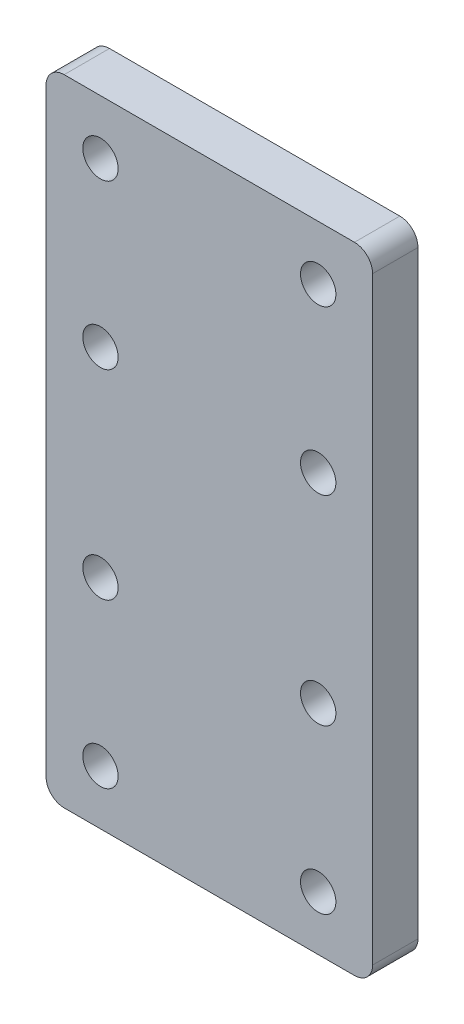
ISO-10303-21;
HEADER;
FILE_DESCRIPTION(('STEP AP214'),'2;1');
FILE_NAME('part.step','',(''),(''),'','','');
FILE_SCHEMA(('AUTOMOTIVE_DESIGN { 1 0 10303 214 1 1 1 1 }'));
ENDSEC;
DATA;
#1=APPLICATION_CONTEXT('core data for automotive mechanical design processes');
#2=APPLICATION_PROTOCOL_DEFINITION('international standard','automotive_design',2000,#1);
#3=PRODUCT_CONTEXT('',#1,'mechanical');
#4=PRODUCT('Part','Part','',(#3));
#5=PRODUCT_RELATED_PRODUCT_CATEGORY('part','',(#4));
#6=PRODUCT_DEFINITION_FORMATION('','',#4);
#7=PRODUCT_DEFINITION_CONTEXT('part definition',#1,'design');
#8=PRODUCT_DEFINITION('design','',#6,#7);
#9=PRODUCT_DEFINITION_SHAPE('','',#8);
#10=(LENGTH_UNIT() NAMED_UNIT(*) SI_UNIT(.MILLI.,.METRE.));
#11=(NAMED_UNIT(*) PLANE_ANGLE_UNIT() SI_UNIT($,.RADIAN.));
#12=(NAMED_UNIT(*) SI_UNIT($,.STERADIAN.) SOLID_ANGLE_UNIT());
#13=UNCERTAINTY_MEASURE_WITH_UNIT(LENGTH_MEASURE(1.E-05),#10,'distance_accuracy_value','');
#14=(GEOMETRIC_REPRESENTATION_CONTEXT(3) GLOBAL_UNCERTAINTY_ASSIGNED_CONTEXT((#13)) GLOBAL_UNIT_ASSIGNED_CONTEXT((#10,
#11,#12)) REPRESENTATION_CONTEXT('',''));
#15=CARTESIAN_POINT('',(0.,0.,0.));
#16=DIRECTION('',(0.,0.,1.));
#17=DIRECTION('',(1.,0.,0.));
#18=AXIS2_PLACEMENT_3D('',#15,#16,#17);
#19=CARTESIAN_POINT('',(90.,90.,5.));
#20=DIRECTION('',(0.,0.,1.));
#21=DIRECTION('',(1.,0.,0.));
#22=AXIS2_PLACEMENT_3D('',#19,#20,#21);
#23=PLANE('',#22);
#24=CARTESIAN_POINT('',(-58.,-29.,5.));
#25=DIRECTION('',(0.,0.,1.));
#26=DIRECTION('',(1.,0.,0.));
#27=AXIS2_PLACEMENT_3D('',#24,#25,#26);
#28=CIRCLE('',#27,1.95);
#29=CARTESIAN_POINT('',(-56.05,-29.,5.));
#30=VERTEX_POINT('',#29);
#31=EDGE_CURVE('E169',#30,#30,#28,.T.);
#32=ORIENTED_EDGE('',*,*,#31,.F.);
#33=EDGE_LOOP('',(#32));
#34=FACE_BOUND('',#33,.T.);
#35=CARTESIAN_POINT('',(-82.,-29.,5.));
#36=DIRECTION('',(0.,0.,1.));
#37=DIRECTION('',(1.,0.,0.));
#38=AXIS2_PLACEMENT_3D('',#35,#36,#37);
#39=CIRCLE('',#38,1.95);
#40=CARTESIAN_POINT('',(-80.05,-29.,5.));
#41=VERTEX_POINT('',#40);
#42=EDGE_CURVE('E181',#41,#41,#39,.T.);
#43=ORIENTED_EDGE('',*,*,#42,.F.);
#44=EDGE_LOOP('',(#43));
#45=FACE_BOUND('',#44,.T.);
#46=CARTESIAN_POINT('',(-58.,11.,5.));
#47=DIRECTION('',(0.,0.,1.));
#48=DIRECTION('',(1.,0.,0.));
#49=AXIS2_PLACEMENT_3D('',#46,#47,#48);
#50=CIRCLE('',#49,1.95);
#51=CARTESIAN_POINT('',(-56.05,11.,5.));
#52=VERTEX_POINT('',#51);
#53=EDGE_CURVE('E193',#52,#52,#50,.T.);
#54=ORIENTED_EDGE('',*,*,#53,.F.);
#55=EDGE_LOOP('',(#54));
#56=FACE_BOUND('',#55,.T.);
#57=CARTESIAN_POINT('',(-58.,29.,5.));
#58=DIRECTION('',(0.,0.,1.));
#59=DIRECTION('',(1.,0.,0.));
#60=AXIS2_PLACEMENT_3D('',#57,#58,#59);
#61=CIRCLE('',#60,1.95);
#62=CARTESIAN_POINT('',(-56.05,29.,5.));
#63=VERTEX_POINT('',#62);
#64=EDGE_CURVE('E205',#63,#63,#61,.T.);
#65=ORIENTED_EDGE('',*,*,#64,.F.);
#66=EDGE_LOOP('',(#65));
#67=FACE_BOUND('',#66,.T.);
#68=CARTESIAN_POINT('',(-82.,29.,5.));
#69=DIRECTION('',(0.,0.,1.));
#70=DIRECTION('',(1.,0.,0.));
#71=AXIS2_PLACEMENT_3D('',#68,#69,#70);
#72=CIRCLE('',#71,1.95);
#73=CARTESIAN_POINT('',(-80.05,29.,5.));
#74=VERTEX_POINT('',#73);
#75=EDGE_CURVE('E124',#74,#74,#72,.T.);
#76=ORIENTED_EDGE('',*,*,#75,.F.);
#77=EDGE_LOOP('',(#76));
#78=FACE_BOUND('',#77,.T.);
#79=CARTESIAN_POINT('',(-82.,11.,5.));
#80=DIRECTION('',(0.,0.,1.));
#81=DIRECTION('',(1.,0.,0.));
#82=AXIS2_PLACEMENT_3D('',#79,#80,#81);
#83=CIRCLE('',#82,1.95);
#84=CARTESIAN_POINT('',(-80.05,11.,5.));
#85=VERTEX_POINT('',#84);
#86=EDGE_CURVE('E199',#85,#85,#83,.T.);
#87=ORIENTED_EDGE('',*,*,#86,.F.);
#88=EDGE_LOOP('',(#87));
#89=FACE_BOUND('',#88,.T.);
#90=CARTESIAN_POINT('',(-82.,-11.,5.));
#91=DIRECTION('',(0.,0.,1.));
#92=DIRECTION('',(1.,0.,0.));
#93=AXIS2_PLACEMENT_3D('',#90,#91,#92);
#94=CIRCLE('',#93,1.95);
#95=CARTESIAN_POINT('',(-80.05,-11.,5.));
#96=VERTEX_POINT('',#95);
#97=EDGE_CURVE('E187',#96,#96,#94,.T.);
#98=ORIENTED_EDGE('',*,*,#97,.F.);
#99=EDGE_LOOP('',(#98));
#100=FACE_BOUND('',#99,.T.);
#101=CARTESIAN_POINT('',(-58.,-11.,5.));
#102=DIRECTION('',(0.,0.,1.));
#103=DIRECTION('',(1.,0.,0.));
#104=AXIS2_PLACEMENT_3D('',#101,#102,#103);
#105=CIRCLE('',#104,1.95);
#106=CARTESIAN_POINT('',(-56.05,-11.,5.));
#107=VERTEX_POINT('',#106);
#108=EDGE_CURVE('E175',#107,#107,#105,.T.);
#109=ORIENTED_EDGE('',*,*,#108,.F.);
#110=EDGE_LOOP('',(#109));
#111=FACE_BOUND('',#110,.T.);
#112=DIRECTION('',(1.,0.,0.));
#113=VECTOR('',#112,1.);
#114=CARTESIAN_POINT('',(0.,-35.,5.));
#115=LINE('',#114,#113);
#116=CARTESIAN_POINT('',(-86.,-35.,5.));
#117=VERTEX_POINT('',#116);
#118=CARTESIAN_POINT('',(-54.,-35.,5.));
#119=VERTEX_POINT('',#118);
#120=EDGE_CURVE('E101',#117,#119,#115,.T.);
#121=ORIENTED_EDGE('',*,*,#120,.T.);
#122=CARTESIAN_POINT('',(-54.,-33.,5.));
#123=DIRECTION('',(0.,0.,1.));
#124=DIRECTION('',(1.,0.,0.));
#125=AXIS2_PLACEMENT_3D('',#122,#123,#124);
#126=CIRCLE('',#125,2.);
#127=CARTESIAN_POINT('',(-52.,-33.,5.));
#128=VERTEX_POINT('',#127);
#129=EDGE_CURVE('E108',#119,#128,#126,.T.);
#130=ORIENTED_EDGE('',*,*,#129,.T.);
#131=DIRECTION('',(0.,1.,0.));
#132=VECTOR('',#131,1.);
#133=CARTESIAN_POINT('',(-52.,0.,5.));
#134=LINE('',#133,#132);
#135=CARTESIAN_POINT('',(-52.,33.,5.));
#136=VERTEX_POINT('',#135);
#137=EDGE_CURVE('E119',#128,#136,#134,.T.);
#138=ORIENTED_EDGE('',*,*,#137,.T.);
#139=CARTESIAN_POINT('',(-54.,33.,5.));
#140=DIRECTION('',(0.,0.,1.));
#141=DIRECTION('',(1.,0.,0.));
#142=AXIS2_PLACEMENT_3D('',#139,#140,#141);
#143=CIRCLE('',#142,2.);
#144=CARTESIAN_POINT('',(-54.,35.,5.));
#145=VERTEX_POINT('',#144);
#146=EDGE_CURVE('E126',#136,#145,#143,.T.);
#147=ORIENTED_EDGE('',*,*,#146,.T.);
#148=DIRECTION('',(1.,0.,0.));
#149=VECTOR('',#148,1.);
#150=CARTESIAN_POINT('',(0.,35.,5.));
#151=LINE('',#150,#149);
#152=CARTESIAN_POINT('',(-86.,35.,5.));
#153=VERTEX_POINT('',#152);
#154=EDGE_CURVE('E167',#153,#145,#151,.T.);
#155=ORIENTED_EDGE('',*,*,#154,.F.);
#156=CARTESIAN_POINT('',(-86.,33.,5.));
#157=DIRECTION('',(0.,0.,1.));
#158=DIRECTION('',(1.,0.,0.));
#159=AXIS2_PLACEMENT_3D('',#156,#157,#158);
#160=CIRCLE('',#159,2.);
#161=CARTESIAN_POINT('',(-88.,33.,5.));
#162=VERTEX_POINT('',#161);
#163=EDGE_CURVE('E109',#153,#162,#160,.T.);
#164=ORIENTED_EDGE('',*,*,#163,.T.);
#165=DIRECTION('',(0.,1.,0.));
#166=VECTOR('',#165,1.);
#167=CARTESIAN_POINT('',(-88.,0.,5.));
#168=LINE('',#167,#166);
#169=CARTESIAN_POINT('',(-88.,-33.,5.));
#170=VERTEX_POINT('',#169);
#171=EDGE_CURVE('E103',#170,#162,#168,.T.);
#172=ORIENTED_EDGE('',*,*,#171,.F.);
#173=CARTESIAN_POINT('',(-86.,-33.,5.));
#174=DIRECTION('',(0.,0.,1.));
#175=DIRECTION('',(1.,0.,0.));
#176=AXIS2_PLACEMENT_3D('',#173,#174,#175);
#177=CIRCLE('',#176,2.);
#178=EDGE_CURVE('E99',#170,#117,#177,.T.);
#179=ORIENTED_EDGE('',*,*,#178,.T.);
#180=EDGE_LOOP('',(#121,#130,#138,#147,#155,#164,#172,#179));
#181=FACE_BOUND('',#180,.T.);
#182=ADVANCED_FACE('F33',(#34,#45,#56,#67,#78,#89,#100,#111,#181),#23,.T.);
#183=CARTESIAN_POINT('',(90.,90.,0.));
#184=DIRECTION('',(0.,0.,1.));
#185=DIRECTION('',(1.,0.,0.));
#186=AXIS2_PLACEMENT_3D('',#183,#184,#185);
#187=PLANE('',#186);
#188=CARTESIAN_POINT('',(-58.,-29.,0.));
#189=DIRECTION('',(0.,0.,1.));
#190=DIRECTION('',(1.,0.,0.));
#191=AXIS2_PLACEMENT_3D('',#188,#189,#190);
#192=CIRCLE('',#191,1.95);
#193=CARTESIAN_POINT('',(-56.05,-29.,0.));
#194=VERTEX_POINT('',#193);
#195=EDGE_CURVE('E158',#194,#194,#192,.T.);
#196=ORIENTED_EDGE('',*,*,#195,.T.);
#197=EDGE_LOOP('',(#196));
#198=FACE_BOUND('',#197,.T.);
#199=CARTESIAN_POINT('',(-58.,-11.,0.));
#200=DIRECTION('',(0.,0.,1.));
#201=DIRECTION('',(1.,0.,0.));
#202=AXIS2_PLACEMENT_3D('',#199,#200,#201);
#203=CIRCLE('',#202,1.95);
#204=CARTESIAN_POINT('',(-56.05,-11.,0.));
#205=VERTEX_POINT('',#204);
#206=EDGE_CURVE('E172',#205,#205,#203,.T.);
#207=ORIENTED_EDGE('',*,*,#206,.T.);
#208=EDGE_LOOP('',(#207));
#209=FACE_BOUND('',#208,.T.);
#210=CARTESIAN_POINT('',(-82.,-29.,0.));
#211=DIRECTION('',(0.,0.,1.));
#212=DIRECTION('',(1.,0.,0.));
#213=AXIS2_PLACEMENT_3D('',#210,#211,#212);
#214=CIRCLE('',#213,1.95);
#215=CARTESIAN_POINT('',(-80.05,-29.,0.));
#216=VERTEX_POINT('',#215);
#217=EDGE_CURVE('E178',#216,#216,#214,.T.);
#218=ORIENTED_EDGE('',*,*,#217,.T.);
#219=EDGE_LOOP('',(#218));
#220=FACE_BOUND('',#219,.T.);
#221=CARTESIAN_POINT('',(-82.,-11.,0.));
#222=DIRECTION('',(0.,0.,1.));
#223=DIRECTION('',(1.,0.,0.));
#224=AXIS2_PLACEMENT_3D('',#221,#222,#223);
#225=CIRCLE('',#224,1.95);
#226=CARTESIAN_POINT('',(-80.05,-11.,0.));
#227=VERTEX_POINT('',#226);
#228=EDGE_CURVE('E184',#227,#227,#225,.T.);
#229=ORIENTED_EDGE('',*,*,#228,.T.);
#230=EDGE_LOOP('',(#229));
#231=FACE_BOUND('',#230,.T.);
#232=CARTESIAN_POINT('',(-58.,11.,0.));
#233=DIRECTION('',(0.,0.,1.));
#234=DIRECTION('',(1.,0.,0.));
#235=AXIS2_PLACEMENT_3D('',#232,#233,#234);
#236=CIRCLE('',#235,1.95);
#237=CARTESIAN_POINT('',(-56.05,11.,0.));
#238=VERTEX_POINT('',#237);
#239=EDGE_CURVE('E190',#238,#238,#236,.T.);
#240=ORIENTED_EDGE('',*,*,#239,.T.);
#241=EDGE_LOOP('',(#240));
#242=FACE_BOUND('',#241,.T.);
#243=CARTESIAN_POINT('',(-82.,11.,0.));
#244=DIRECTION('',(0.,0.,1.));
#245=DIRECTION('',(1.,0.,0.));
#246=AXIS2_PLACEMENT_3D('',#243,#244,#245);
#247=CIRCLE('',#246,1.95);
#248=CARTESIAN_POINT('',(-80.05,11.,0.));
#249=VERTEX_POINT('',#248);
#250=EDGE_CURVE('E196',#249,#249,#247,.T.);
#251=ORIENTED_EDGE('',*,*,#250,.T.);
#252=EDGE_LOOP('',(#251));
#253=FACE_BOUND('',#252,.T.);
#254=CARTESIAN_POINT('',(-58.,29.,0.));
#255=DIRECTION('',(0.,0.,1.));
#256=DIRECTION('',(1.,0.,0.));
#257=AXIS2_PLACEMENT_3D('',#254,#255,#256);
#258=CIRCLE('',#257,1.95);
#259=CARTESIAN_POINT('',(-56.05,29.,0.));
#260=VERTEX_POINT('',#259);
#261=EDGE_CURVE('E202',#260,#260,#258,.T.);
#262=ORIENTED_EDGE('',*,*,#261,.T.);
#263=EDGE_LOOP('',(#262));
#264=FACE_BOUND('',#263,.T.);
#265=CARTESIAN_POINT('',(-82.,29.,0.));
#266=DIRECTION('',(0.,0.,1.));
#267=DIRECTION('',(1.,0.,0.));
#268=AXIS2_PLACEMENT_3D('',#265,#266,#267);
#269=CIRCLE('',#268,1.95);
#270=CARTESIAN_POINT('',(-80.05,29.,0.));
#271=VERTEX_POINT('',#270);
#272=EDGE_CURVE('E129',#271,#271,#269,.T.);
#273=ORIENTED_EDGE('',*,*,#272,.T.);
#274=EDGE_LOOP('',(#273));
#275=FACE_BOUND('',#274,.T.);
#276=DIRECTION('',(0.,1.,0.));
#277=VECTOR('',#276,1.);
#278=CARTESIAN_POINT('',(-52.,0.,0.));
#279=LINE('',#278,#277);
#280=CARTESIAN_POINT('',(-52.,-33.,0.));
#281=VERTEX_POINT('',#280);
#282=CARTESIAN_POINT('',(-52.,33.,0.));
#283=VERTEX_POINT('',#282);
#284=EDGE_CURVE('E160',#281,#283,#279,.T.);
#285=ORIENTED_EDGE('',*,*,#284,.F.);
#286=CARTESIAN_POINT('',(-54.,-33.,0.));
#287=DIRECTION('',(0.,0.,1.));
#288=DIRECTION('',(1.,0.,0.));
#289=AXIS2_PLACEMENT_3D('',#286,#287,#288);
#290=CIRCLE('',#289,2.);
#291=CARTESIAN_POINT('',(-54.,-35.,0.));
#292=VERTEX_POINT('',#291);
#293=EDGE_CURVE('E145',#281,#292,#290,.F.);
#294=ORIENTED_EDGE('',*,*,#293,.T.);
#295=DIRECTION('',(1.,0.,0.));
#296=VECTOR('',#295,1.);
#297=CARTESIAN_POINT('',(0.,-35.,0.));
#298=LINE('',#297,#296);
#299=CARTESIAN_POINT('',(-86.,-35.,0.));
#300=VERTEX_POINT('',#299);
#301=EDGE_CURVE('E156',#300,#292,#298,.T.);
#302=ORIENTED_EDGE('',*,*,#301,.F.);
#303=CARTESIAN_POINT('',(-86.,-33.,0.));
#304=DIRECTION('',(0.,0.,1.));
#305=DIRECTION('',(1.,0.,0.));
#306=AXIS2_PLACEMENT_3D('',#303,#304,#305);
#307=CIRCLE('',#306,2.);
#308=CARTESIAN_POINT('',(-88.,-33.,0.));
#309=VERTEX_POINT('',#308);
#310=EDGE_CURVE('E123',#300,#309,#307,.F.);
#311=ORIENTED_EDGE('',*,*,#310,.T.);
#312=DIRECTION('',(0.,1.,0.));
#313=VECTOR('',#312,1.);
#314=CARTESIAN_POINT('',(-88.,0.,0.));
#315=LINE('',#314,#313);
#316=CARTESIAN_POINT('',(-88.,33.,0.));
#317=VERTEX_POINT('',#316);
#318=EDGE_CURVE('E154',#309,#317,#315,.T.);
#319=ORIENTED_EDGE('',*,*,#318,.T.);
#320=CARTESIAN_POINT('',(-86.,33.,0.));
#321=DIRECTION('',(0.,0.,1.));
#322=DIRECTION('',(1.,0.,0.));
#323=AXIS2_PLACEMENT_3D('',#320,#321,#322);
#324=CIRCLE('',#323,2.);
#325=CARTESIAN_POINT('',(-86.,35.,0.));
#326=VERTEX_POINT('',#325);
#327=EDGE_CURVE('E54',#317,#326,#324,.F.);
#328=ORIENTED_EDGE('',*,*,#327,.T.);
#329=DIRECTION('',(1.,0.,0.));
#330=VECTOR('',#329,1.);
#331=CARTESIAN_POINT('',(0.,35.,0.));
#332=LINE('',#331,#330);
#333=CARTESIAN_POINT('',(-54.,35.,0.));
#334=VERTEX_POINT('',#333);
#335=EDGE_CURVE('E155',#326,#334,#332,.T.);
#336=ORIENTED_EDGE('',*,*,#335,.T.);
#337=CARTESIAN_POINT('',(-54.,33.,0.));
#338=DIRECTION('',(0.,0.,1.));
#339=DIRECTION('',(1.,0.,0.));
#340=AXIS2_PLACEMENT_3D('',#337,#338,#339);
#341=CIRCLE('',#340,2.);
#342=EDGE_CURVE('E141',#334,#283,#341,.F.);
#343=ORIENTED_EDGE('',*,*,#342,.T.);
#344=EDGE_LOOP('',(#285,#294,#302,#311,#319,#328,#336,#343));
#345=FACE_BOUND('',#344,.T.);
#346=ADVANCED_FACE('F211',(#198,#209,#220,#231,#242,#253,#264,#275,#345),#187,.F.);
#347=CARTESIAN_POINT('',(-82.,29.,5.));
#348=DIRECTION('',(0.,0.,-1.));
#349=DIRECTION('',(-1.,0.,0.));
#350=AXIS2_PLACEMENT_3D('',#347,#348,#349);
#351=CYLINDRICAL_SURFACE('',#350,1.95);
#352=ORIENTED_EDGE('',*,*,#75,.T.);
#353=EDGE_LOOP('',(#352));
#354=FACE_BOUND('',#353,.T.);
#355=ORIENTED_EDGE('',*,*,#272,.F.);
#356=EDGE_LOOP('',(#355));
#357=FACE_BOUND('',#356,.T.);
#358=ADVANCED_FACE('F217',(#354,#357),#351,.F.);
#359=CARTESIAN_POINT('',(-58.,29.,5.));
#360=DIRECTION('',(0.,0.,-1.));
#361=DIRECTION('',(-1.,0.,0.));
#362=AXIS2_PLACEMENT_3D('',#359,#360,#361);
#363=CYLINDRICAL_SURFACE('',#362,1.95);
#364=ORIENTED_EDGE('',*,*,#64,.T.);
#365=EDGE_LOOP('',(#364));
#366=FACE_BOUND('',#365,.T.);
#367=ORIENTED_EDGE('',*,*,#261,.F.);
#368=EDGE_LOOP('',(#367));
#369=FACE_BOUND('',#368,.T.);
#370=ADVANCED_FACE('F214',(#366,#369),#363,.F.);
#371=CARTESIAN_POINT('',(-82.,11.,5.));
#372=DIRECTION('',(0.,0.,-1.));
#373=DIRECTION('',(-1.,0.,0.));
#374=AXIS2_PLACEMENT_3D('',#371,#372,#373);
#375=CYLINDRICAL_SURFACE('',#374,1.95);
#376=ORIENTED_EDGE('',*,*,#86,.T.);
#377=EDGE_LOOP('',(#376));
#378=FACE_BOUND('',#377,.T.);
#379=ORIENTED_EDGE('',*,*,#250,.F.);
#380=EDGE_LOOP('',(#379));
#381=FACE_BOUND('',#380,.T.);
#382=ADVANCED_FACE('F216',(#378,#381),#375,.F.);
#383=CARTESIAN_POINT('',(-58.,11.,5.));
#384=DIRECTION('',(0.,0.,-1.));
#385=DIRECTION('',(-1.,0.,0.));
#386=AXIS2_PLACEMENT_3D('',#383,#384,#385);
#387=CYLINDRICAL_SURFACE('',#386,1.95);
#388=ORIENTED_EDGE('',*,*,#53,.T.);
#389=EDGE_LOOP('',(#388));
#390=FACE_BOUND('',#389,.T.);
#391=ORIENTED_EDGE('',*,*,#239,.F.);
#392=EDGE_LOOP('',(#391));
#393=FACE_BOUND('',#392,.T.);
#394=ADVANCED_FACE('F224',(#390,#393),#387,.F.);
#395=CARTESIAN_POINT('',(-82.,-11.,5.));
#396=DIRECTION('',(0.,0.,-1.));
#397=DIRECTION('',(-1.,0.,0.));
#398=AXIS2_PLACEMENT_3D('',#395,#396,#397);
#399=CYLINDRICAL_SURFACE('',#398,1.95);
#400=ORIENTED_EDGE('',*,*,#97,.T.);
#401=EDGE_LOOP('',(#400));
#402=FACE_BOUND('',#401,.T.);
#403=ORIENTED_EDGE('',*,*,#228,.F.);
#404=EDGE_LOOP('',(#403));
#405=FACE_BOUND('',#404,.T.);
#406=ADVANCED_FACE('F284',(#402,#405),#399,.F.);
#407=CARTESIAN_POINT('',(-82.,-29.,5.));
#408=DIRECTION('',(0.,0.,-1.));
#409=DIRECTION('',(-1.,0.,0.));
#410=AXIS2_PLACEMENT_3D('',#407,#408,#409);
#411=CYLINDRICAL_SURFACE('',#410,1.95);
#412=ORIENTED_EDGE('',*,*,#42,.T.);
#413=EDGE_LOOP('',(#412));
#414=FACE_BOUND('',#413,.T.);
#415=ORIENTED_EDGE('',*,*,#217,.F.);
#416=EDGE_LOOP('',(#415));
#417=FACE_BOUND('',#416,.T.);
#418=ADVANCED_FACE('F280',(#414,#417),#411,.F.);
#419=CARTESIAN_POINT('',(-58.,-11.,5.));
#420=DIRECTION('',(0.,0.,-1.));
#421=DIRECTION('',(-1.,0.,0.));
#422=AXIS2_PLACEMENT_3D('',#419,#420,#421);
#423=CYLINDRICAL_SURFACE('',#422,1.95);
#424=ORIENTED_EDGE('',*,*,#108,.T.);
#425=EDGE_LOOP('',(#424));
#426=FACE_BOUND('',#425,.T.);
#427=ORIENTED_EDGE('',*,*,#206,.F.);
#428=EDGE_LOOP('',(#427));
#429=FACE_BOUND('',#428,.T.);
#430=ADVANCED_FACE('F272',(#426,#429),#423,.F.);
#431=CARTESIAN_POINT('',(-58.,-29.,5.));
#432=DIRECTION('',(0.,0.,-1.));
#433=DIRECTION('',(-1.,0.,0.));
#434=AXIS2_PLACEMENT_3D('',#431,#432,#433);
#435=CYLINDRICAL_SURFACE('',#434,1.95);
#436=ORIENTED_EDGE('',*,*,#31,.T.);
#437=EDGE_LOOP('',(#436));
#438=FACE_BOUND('',#437,.T.);
#439=ORIENTED_EDGE('',*,*,#195,.F.);
#440=EDGE_LOOP('',(#439));
#441=FACE_BOUND('',#440,.T.);
#442=ADVANCED_FACE('F265',(#438,#441),#435,.F.);
#443=CARTESIAN_POINT('',(-52.,0.,0.));
#444=DIRECTION('',(1.,0.,0.));
#445=DIRECTION('',(0.,1.,0.));
#446=AXIS2_PLACEMENT_3D('',#443,#444,#445);
#447=PLANE('',#446);
#448=ORIENTED_EDGE('',*,*,#137,.F.);
#449=DIRECTION('',(0.,0.,1.));
#450=VECTOR('',#449,1.);
#451=CARTESIAN_POINT('',(-52.,-33.,0.));
#452=LINE('',#451,#450);
#453=EDGE_CURVE('E139',#128,#281,#452,.F.);
#454=ORIENTED_EDGE('',*,*,#453,.T.);
#455=ORIENTED_EDGE('',*,*,#284,.T.);
#456=DIRECTION('',(0.,0.,1.));
#457=VECTOR('',#456,1.);
#458=CARTESIAN_POINT('',(-52.,33.,5.));
#459=LINE('',#458,#457);
#460=EDGE_CURVE('E136',#283,#136,#459,.T.);
#461=ORIENTED_EDGE('',*,*,#460,.T.);
#462=EDGE_LOOP('',(#448,#454,#455,#461));
#463=FACE_BOUND('',#462,.T.);
#464=ADVANCED_FACE('F260',(#463),#447,.T.);
#465=CARTESIAN_POINT('',(0.,35.,0.));
#466=DIRECTION('',(0.,-1.,0.));
#467=DIRECTION('',(1.,0.,0.));
#468=AXIS2_PLACEMENT_3D('',#465,#466,#467);
#469=PLANE('',#468);
#470=ORIENTED_EDGE('',*,*,#335,.F.);
#471=DIRECTION('',(0.,0.,1.));
#472=VECTOR('',#471,1.);
#473=CARTESIAN_POINT('',(-86.,35.,0.));
#474=LINE('',#473,#472);
#475=EDGE_CURVE('E11',#326,#153,#474,.T.);
#476=ORIENTED_EDGE('',*,*,#475,.T.);
#477=ORIENTED_EDGE('',*,*,#154,.T.);
#478=DIRECTION('',(0.,0.,1.));
#479=VECTOR('',#478,1.);
#480=CARTESIAN_POINT('',(-54.,35.,0.));
#481=LINE('',#480,#479);
#482=EDGE_CURVE('E41',#145,#334,#481,.F.);
#483=ORIENTED_EDGE('',*,*,#482,.T.);
#484=EDGE_LOOP('',(#470,#476,#477,#483));
#485=FACE_BOUND('',#484,.T.);
#486=ADVANCED_FACE('F254',(#485),#469,.F.);
#487=CARTESIAN_POINT('',(-88.,0.,0.));
#488=DIRECTION('',(1.,0.,0.));
#489=DIRECTION('',(0.,0.,-1.));
#490=AXIS2_PLACEMENT_3D('',#487,#488,#489);
#491=PLANE('',#490);
#492=ORIENTED_EDGE('',*,*,#318,.F.);
#493=DIRECTION('',(0.,0.,1.));
#494=VECTOR('',#493,1.);
#495=CARTESIAN_POINT('',(-88.,-33.,5.));
#496=LINE('',#495,#494);
#497=EDGE_CURVE('E149',#309,#170,#496,.T.);
#498=ORIENTED_EDGE('',*,*,#497,.T.);
#499=ORIENTED_EDGE('',*,*,#171,.T.);
#500=DIRECTION('',(0.,0.,1.));
#501=VECTOR('',#500,1.);
#502=CARTESIAN_POINT('',(-88.,33.,0.));
#503=LINE('',#502,#501);
#504=EDGE_CURVE('E147',#162,#317,#503,.F.);
#505=ORIENTED_EDGE('',*,*,#504,.T.);
#506=EDGE_LOOP('',(#492,#498,#499,#505));
#507=FACE_BOUND('',#506,.T.);
#508=ADVANCED_FACE('F152',(#507),#491,.F.);
#509=CARTESIAN_POINT('',(0.,-35.,0.));
#510=DIRECTION('',(0.,-1.,0.));
#511=DIRECTION('',(0.,0.,-1.));
#512=AXIS2_PLACEMENT_3D('',#509,#510,#511);
#513=PLANE('',#512);
#514=ORIENTED_EDGE('',*,*,#301,.T.);
#515=DIRECTION('',(0.,0.,1.));
#516=VECTOR('',#515,1.);
#517=CARTESIAN_POINT('',(-54.,-35.,0.));
#518=LINE('',#517,#516);
#519=EDGE_CURVE('E118',#292,#119,#518,.T.);
#520=ORIENTED_EDGE('',*,*,#519,.T.);
#521=ORIENTED_EDGE('',*,*,#120,.F.);
#522=DIRECTION('',(0.,0.,1.));
#523=VECTOR('',#522,1.);
#524=CARTESIAN_POINT('',(-86.,-35.,0.));
#525=LINE('',#524,#523);
#526=EDGE_CURVE('E115',#117,#300,#525,.F.);
#527=ORIENTED_EDGE('',*,*,#526,.T.);
#528=EDGE_LOOP('',(#514,#520,#521,#527));
#529=FACE_BOUND('',#528,.T.);
#530=ADVANCED_FACE('F114',(#529),#513,.T.);
#531=CARTESIAN_POINT('',(-54.,-33.,0.));
#532=DIRECTION('',(0.,0.,1.));
#533=DIRECTION('',(1.,0.,0.));
#534=AXIS2_PLACEMENT_3D('',#531,#532,#533);
#535=CYLINDRICAL_SURFACE('',#534,2.);
#536=ORIENTED_EDGE('',*,*,#293,.F.);
#537=ORIENTED_EDGE('',*,*,#453,.F.);
#538=ORIENTED_EDGE('',*,*,#129,.F.);
#539=ORIENTED_EDGE('',*,*,#519,.F.);
#540=EDGE_LOOP('',(#536,#537,#538,#539));
#541=FACE_BOUND('',#540,.T.);
#542=ADVANCED_FACE('F240',(#541),#535,.T.);
#543=CARTESIAN_POINT('',(-86.,-33.,0.));
#544=DIRECTION('',(0.,0.,-1.));
#545=DIRECTION('',(-1.,0.,0.));
#546=AXIS2_PLACEMENT_3D('',#543,#544,#545);
#547=CYLINDRICAL_SURFACE('',#546,2.);
#548=ORIENTED_EDGE('',*,*,#310,.F.);
#549=ORIENTED_EDGE('',*,*,#526,.F.);
#550=ORIENTED_EDGE('',*,*,#178,.F.);
#551=ORIENTED_EDGE('',*,*,#497,.F.);
#552=EDGE_LOOP('',(#548,#549,#550,#551));
#553=FACE_BOUND('',#552,.T.);
#554=ADVANCED_FACE('F122',(#553),#547,.T.);
#555=CARTESIAN_POINT('',(-86.,33.,0.));
#556=DIRECTION('',(0.,0.,1.));
#557=DIRECTION('',(1.,0.,0.));
#558=AXIS2_PLACEMENT_3D('',#555,#556,#557);
#559=CYLINDRICAL_SURFACE('',#558,2.);
#560=ORIENTED_EDGE('',*,*,#327,.F.);
#561=ORIENTED_EDGE('',*,*,#504,.F.);
#562=ORIENTED_EDGE('',*,*,#163,.F.);
#563=ORIENTED_EDGE('',*,*,#475,.F.);
#564=EDGE_LOOP('',(#560,#561,#562,#563));
#565=FACE_BOUND('',#564,.T.);
#566=ADVANCED_FACE('F245',(#565),#559,.T.);
#567=CARTESIAN_POINT('',(-54.,33.,0.));
#568=DIRECTION('',(0.,0.,-1.));
#569=DIRECTION('',(-1.,0.,0.));
#570=AXIS2_PLACEMENT_3D('',#567,#568,#569);
#571=CYLINDRICAL_SURFACE('',#570,2.);
#572=ORIENTED_EDGE('',*,*,#342,.F.);
#573=ORIENTED_EDGE('',*,*,#482,.F.);
#574=ORIENTED_EDGE('',*,*,#146,.F.);
#575=ORIENTED_EDGE('',*,*,#460,.F.);
#576=EDGE_LOOP('',(#572,#573,#574,#575));
#577=FACE_BOUND('',#576,.T.);
#578=ADVANCED_FACE('F35',(#577),#571,.T.);
#579=CLOSED_SHELL('',(#182,#346,#358,#370,#382,#394,#406,#418,#430,#442,#464,#486,#508,#530,
#542,#554,#566,#578));
#580=MANIFOLD_SOLID_BREP('B2',#579);
#581=ADVANCED_BREP_SHAPE_REPRESENTATION('',(#18,#580),#14);
#582=SHAPE_DEFINITION_REPRESENTATION(#9,#581);
ENDSEC;
END-ISO-10303-21;
